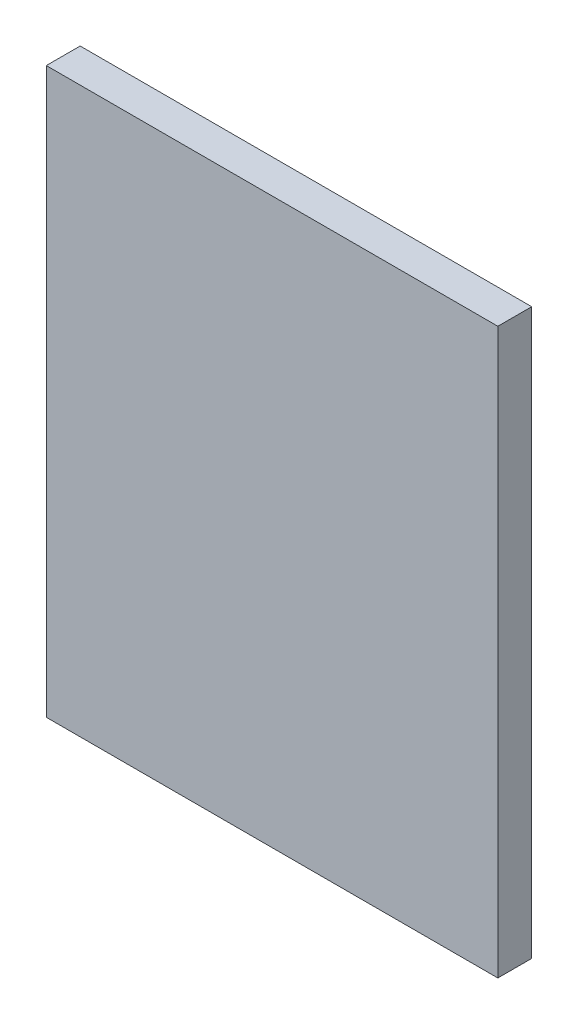
ISO-10303-21;
HEADER;
FILE_DESCRIPTION(('STEP AP214'),'2;1');
FILE_NAME('part.step','',(''),(''),'','','');
FILE_SCHEMA(('AUTOMOTIVE_DESIGN { 1 0 10303 214 1 1 1 1 }'));
ENDSEC;
DATA;
#1=APPLICATION_CONTEXT('core data for automotive mechanical design processes');
#2=APPLICATION_PROTOCOL_DEFINITION('international standard','automotive_design',2000,#1);
#3=PRODUCT_CONTEXT('',#1,'mechanical');
#4=PRODUCT('Part','Part','',(#3));
#5=PRODUCT_RELATED_PRODUCT_CATEGORY('part','',(#4));
#6=PRODUCT_DEFINITION_FORMATION('','',#4);
#7=PRODUCT_DEFINITION_CONTEXT('part definition',#1,'design');
#8=PRODUCT_DEFINITION('design','',#6,#7);
#9=PRODUCT_DEFINITION_SHAPE('','',#8);
#10=(LENGTH_UNIT() NAMED_UNIT(*) SI_UNIT(.MILLI.,.METRE.));
#11=(NAMED_UNIT(*) PLANE_ANGLE_UNIT() SI_UNIT($,.RADIAN.));
#12=(NAMED_UNIT(*) SI_UNIT($,.STERADIAN.) SOLID_ANGLE_UNIT());
#13=UNCERTAINTY_MEASURE_WITH_UNIT(LENGTH_MEASURE(1.E-05),#10,'distance_accuracy_value','');
#14=(GEOMETRIC_REPRESENTATION_CONTEXT(3) GLOBAL_UNCERTAINTY_ASSIGNED_CONTEXT((#13)) GLOBAL_UNIT_ASSIGNED_CONTEXT((#10,
#11,#12)) REPRESENTATION_CONTEXT('',''));
#15=CARTESIAN_POINT('',(0.,0.,0.));
#16=DIRECTION('',(0.,0.,1.));
#17=DIRECTION('',(1.,0.,0.));
#18=AXIS2_PLACEMENT_3D('',#15,#16,#17);
#19=CARTESIAN_POINT('',(40.,50.,6.));
#20=DIRECTION('',(-1.,0.,0.));
#21=DIRECTION('',(0.,-1.,0.));
#22=AXIS2_PLACEMENT_3D('',#19,#20,#21);
#23=PLANE('',#22);
#24=DIRECTION('',(0.,1.,0.));
#25=VECTOR('',#24,1.);
#26=CARTESIAN_POINT('',(40.,50.,0.));
#27=LINE('',#26,#25);
#28=CARTESIAN_POINT('',(40.,-50.,0.));
#29=VERTEX_POINT('',#28);
#30=CARTESIAN_POINT('',(40.,50.,0.));
#31=VERTEX_POINT('',#30);
#32=EDGE_CURVE('E100',#29,#31,#27,.T.);
#33=ORIENTED_EDGE('',*,*,#32,.T.);
#34=DIRECTION('',(0.,0.,-1.));
#35=VECTOR('',#34,1.);
#36=CARTESIAN_POINT('',(40.,50.,6.));
#37=LINE('',#36,#35);
#38=CARTESIAN_POINT('',(40.,50.,6.));
#39=VERTEX_POINT('',#38);
#40=EDGE_CURVE('E11',#39,#31,#37,.T.);
#41=ORIENTED_EDGE('',*,*,#40,.F.);
#42=DIRECTION('',(0.,1.,0.));
#43=VECTOR('',#42,1.);
#44=CARTESIAN_POINT('',(40.,50.,6.));
#45=LINE('',#44,#43);
#46=CARTESIAN_POINT('',(40.,-50.,6.));
#47=VERTEX_POINT('',#46);
#48=EDGE_CURVE('E88',#47,#39,#45,.T.);
#49=ORIENTED_EDGE('',*,*,#48,.F.);
#50=DIRECTION('',(0.,0.,-1.));
#51=VECTOR('',#50,1.);
#52=CARTESIAN_POINT('',(40.,-50.,6.));
#53=LINE('',#52,#51);
#54=EDGE_CURVE('E96',#47,#29,#53,.T.);
#55=ORIENTED_EDGE('',*,*,#54,.T.);
#56=EDGE_LOOP('',(#33,#41,#49,#55));
#57=FACE_BOUND('',#56,.T.);
#58=ADVANCED_FACE('F37',(#57),#23,.F.);
#59=CARTESIAN_POINT('',(-40.,50.,6.));
#60=DIRECTION('',(0.,-1.,0.));
#61=DIRECTION('',(0.,0.,-1.));
#62=AXIS2_PLACEMENT_3D('',#59,#60,#61);
#63=PLANE('',#62);
#64=DIRECTION('',(-1.,0.,0.));
#65=VECTOR('',#64,1.);
#66=CARTESIAN_POINT('',(-40.,50.,0.));
#67=LINE('',#66,#65);
#68=CARTESIAN_POINT('',(-40.,50.,0.));
#69=VERTEX_POINT('',#68);
#70=EDGE_CURVE('E92',#31,#69,#67,.T.);
#71=ORIENTED_EDGE('',*,*,#70,.T.);
#72=DIRECTION('',(0.,0.,-1.));
#73=VECTOR('',#72,1.);
#74=CARTESIAN_POINT('',(-40.,50.,6.));
#75=LINE('',#74,#73);
#76=CARTESIAN_POINT('',(-40.,50.,6.));
#77=VERTEX_POINT('',#76);
#78=EDGE_CURVE('E45',#77,#69,#75,.T.);
#79=ORIENTED_EDGE('',*,*,#78,.F.);
#80=DIRECTION('',(-1.,0.,0.));
#81=VECTOR('',#80,1.);
#82=CARTESIAN_POINT('',(-40.,50.,6.));
#83=LINE('',#82,#81);
#84=EDGE_CURVE('E83',#39,#77,#83,.T.);
#85=ORIENTED_EDGE('',*,*,#84,.F.);
#86=ORIENTED_EDGE('',*,*,#40,.T.);
#87=EDGE_LOOP('',(#71,#79,#85,#86));
#88=FACE_BOUND('',#87,.T.);
#89=ADVANCED_FACE('F91',(#88),#63,.F.);
#90=CARTESIAN_POINT('',(-40.,50.,6.));
#91=DIRECTION('',(1.,0.,0.));
#92=DIRECTION('',(0.,1.,0.));
#93=AXIS2_PLACEMENT_3D('',#90,#91,#92);
#94=PLANE('',#93);
#95=DIRECTION('',(0.,-1.,0.));
#96=VECTOR('',#95,1.);
#97=CARTESIAN_POINT('',(-40.,50.,0.));
#98=LINE('',#97,#96);
#99=CARTESIAN_POINT('',(-40.,-50.,0.));
#100=VERTEX_POINT('',#99);
#101=EDGE_CURVE('E70',#69,#100,#98,.T.);
#102=ORIENTED_EDGE('',*,*,#101,.T.);
#103=DIRECTION('',(0.,0.,-1.));
#104=VECTOR('',#103,1.);
#105=CARTESIAN_POINT('',(-40.,-50.,6.));
#106=LINE('',#105,#104);
#107=CARTESIAN_POINT('',(-40.,-50.,6.));
#108=VERTEX_POINT('',#107);
#109=EDGE_CURVE('E93',#108,#100,#106,.T.);
#110=ORIENTED_EDGE('',*,*,#109,.F.);
#111=DIRECTION('',(0.,-1.,0.));
#112=VECTOR('',#111,1.);
#113=CARTESIAN_POINT('',(-40.,50.,6.));
#114=LINE('',#113,#112);
#115=EDGE_CURVE('E86',#77,#108,#114,.T.);
#116=ORIENTED_EDGE('',*,*,#115,.F.);
#117=ORIENTED_EDGE('',*,*,#78,.T.);
#118=EDGE_LOOP('',(#102,#110,#116,#117));
#119=FACE_BOUND('',#118,.T.);
#120=ADVANCED_FACE('F94',(#119),#94,.F.);
#121=CARTESIAN_POINT('',(-40.,-50.,6.));
#122=DIRECTION('',(0.,1.,0.));
#123=DIRECTION('',(-1.,0.,0.));
#124=AXIS2_PLACEMENT_3D('',#121,#122,#123);
#125=PLANE('',#124);
#126=DIRECTION('',(1.,0.,0.));
#127=VECTOR('',#126,1.);
#128=CARTESIAN_POINT('',(-40.,-50.,0.));
#129=LINE('',#128,#127);
#130=EDGE_CURVE('E76',#100,#29,#129,.T.);
#131=ORIENTED_EDGE('',*,*,#130,.T.);
#132=ORIENTED_EDGE('',*,*,#54,.F.);
#133=DIRECTION('',(1.,0.,0.));
#134=VECTOR('',#133,1.);
#135=CARTESIAN_POINT('',(-40.,-50.,6.));
#136=LINE('',#135,#134);
#137=EDGE_CURVE('E53',#108,#47,#136,.T.);
#138=ORIENTED_EDGE('',*,*,#137,.F.);
#139=ORIENTED_EDGE('',*,*,#109,.T.);
#140=EDGE_LOOP('',(#131,#132,#138,#139));
#141=FACE_BOUND('',#140,.T.);
#142=ADVANCED_FACE('F107',(#141),#125,.F.);
#143=CARTESIAN_POINT('',(0.,0.,6.));
#144=DIRECTION('',(0.,0.,1.));
#145=DIRECTION('',(1.,0.,0.));
#146=AXIS2_PLACEMENT_3D('',#143,#144,#145);
#147=PLANE('',#146);
#148=ORIENTED_EDGE('',*,*,#48,.T.);
#149=ORIENTED_EDGE('',*,*,#84,.T.);
#150=ORIENTED_EDGE('',*,*,#115,.T.);
#151=ORIENTED_EDGE('',*,*,#137,.T.);
#152=EDGE_LOOP('',(#148,#149,#150,#151));
#153=FACE_BOUND('',#152,.T.);
#154=ADVANCED_FACE('F84',(#153),#147,.T.);
#155=CARTESIAN_POINT('',(0.,0.,0.));
#156=DIRECTION('',(0.,0.,1.));
#157=DIRECTION('',(1.,0.,0.));
#158=AXIS2_PLACEMENT_3D('',#155,#156,#157);
#159=PLANE('',#158);
#160=ORIENTED_EDGE('',*,*,#32,.F.);
#161=ORIENTED_EDGE('',*,*,#130,.F.);
#162=ORIENTED_EDGE('',*,*,#101,.F.);
#163=ORIENTED_EDGE('',*,*,#70,.F.);
#164=EDGE_LOOP('',(#160,#161,#162,#163));
#165=FACE_BOUND('',#164,.T.);
#166=ADVANCED_FACE('F110',(#165),#159,.F.);
#167=CLOSED_SHELL('',(#58,#89,#120,#142,#154,#166));
#168=MANIFOLD_SOLID_BREP('B2',#167);
#169=ADVANCED_BREP_SHAPE_REPRESENTATION('',(#18,#168),#14);
#170=SHAPE_DEFINITION_REPRESENTATION(#9,#169);
ENDSEC;
END-ISO-10303-21;
